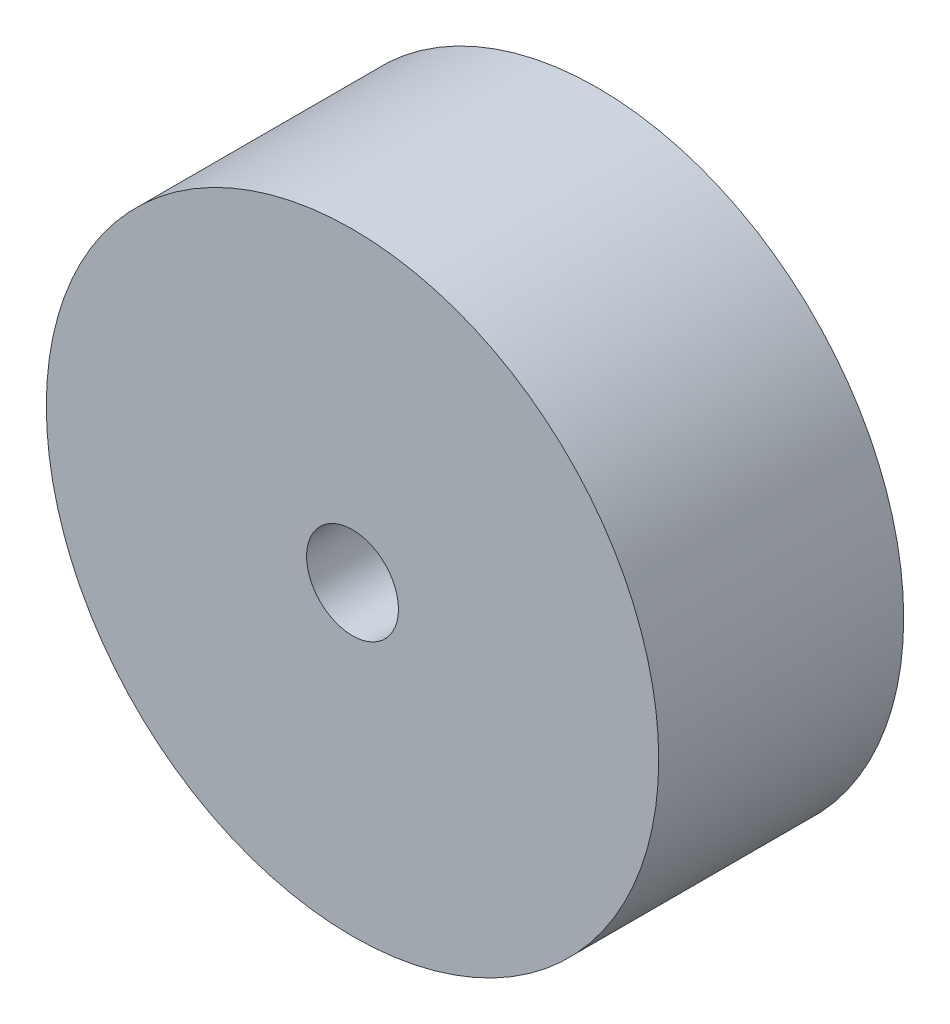
ISO-10303-21;
HEADER;
FILE_DESCRIPTION(('STEP AP214'),'2;1');
FILE_NAME('part.step','',(''),(''),'','','');
FILE_SCHEMA(('AUTOMOTIVE_DESIGN { 1 0 10303 214 1 1 1 1 }'));
ENDSEC;
DATA;
#1=APPLICATION_CONTEXT('core data for automotive mechanical design processes');
#2=APPLICATION_PROTOCOL_DEFINITION('international standard','automotive_design',2000,#1);
#3=PRODUCT_CONTEXT('',#1,'mechanical');
#4=PRODUCT('Part','Part','',(#3));
#5=PRODUCT_RELATED_PRODUCT_CATEGORY('part','',(#4));
#6=PRODUCT_DEFINITION_FORMATION('','',#4);
#7=PRODUCT_DEFINITION_CONTEXT('part definition',#1,'design');
#8=PRODUCT_DEFINITION('design','',#6,#7);
#9=PRODUCT_DEFINITION_SHAPE('','',#8);
#10=(LENGTH_UNIT() NAMED_UNIT(*) SI_UNIT(.MILLI.,.METRE.));
#11=(NAMED_UNIT(*) PLANE_ANGLE_UNIT() SI_UNIT($,.RADIAN.));
#12=(NAMED_UNIT(*) SI_UNIT($,.STERADIAN.) SOLID_ANGLE_UNIT());
#13=UNCERTAINTY_MEASURE_WITH_UNIT(LENGTH_MEASURE(1.E-05),#10,'distance_accuracy_value','');
#14=(GEOMETRIC_REPRESENTATION_CONTEXT(3) GLOBAL_UNCERTAINTY_ASSIGNED_CONTEXT((#13)) GLOBAL_UNIT_ASSIGNED_CONTEXT((#10,
#11,#12)) REPRESENTATION_CONTEXT('',''));
#15=CARTESIAN_POINT('',(0.,0.,0.));
#16=DIRECTION('',(0.,0.,1.));
#17=DIRECTION('',(1.,0.,0.));
#18=AXIS2_PLACEMENT_3D('',#15,#16,#17);
#19=CARTESIAN_POINT('',(0.,0.,8.));
#20=DIRECTION('',(0.,0.,1.));
#21=DIRECTION('',(1.,0.,0.));
#22=AXIS2_PLACEMENT_3D('',#19,#20,#21);
#23=PLANE('',#22);
#24=CARTESIAN_POINT('',(0.,0.,8.));
#25=DIRECTION('',(0.,0.,1.));
#26=DIRECTION('',(1.,0.,0.));
#27=AXIS2_PLACEMENT_3D('',#24,#25,#26);
#28=CIRCLE('',#27,10.);
#29=CARTESIAN_POINT('',(10.,0.,8.));
#30=VERTEX_POINT('',#29);
#31=EDGE_CURVE('E10',#30,#30,#28,.T.);
#32=ORIENTED_EDGE('',*,*,#31,.T.);
#33=EDGE_LOOP('',(#32));
#34=FACE_BOUND('',#33,.T.);
#35=CARTESIAN_POINT('',(0.,0.,8.));
#36=DIRECTION('',(0.,0.,1.));
#37=DIRECTION('',(1.,0.,0.));
#38=AXIS2_PLACEMENT_3D('',#35,#36,#37);
#39=CIRCLE('',#38,1.5);
#40=CARTESIAN_POINT('',(1.5,0.,8.));
#41=VERTEX_POINT('',#40);
#42=EDGE_CURVE('E42',#41,#41,#39,.T.);
#43=ORIENTED_EDGE('',*,*,#42,.F.);
#44=EDGE_LOOP('',(#43));
#45=FACE_BOUND('',#44,.T.);
#46=ADVANCED_FACE('F31',(#34,#45),#23,.T.);
#47=CARTESIAN_POINT('',(0.,0.,0.));
#48=DIRECTION('',(0.,0.,1.));
#49=DIRECTION('',(1.,0.,0.));
#50=AXIS2_PLACEMENT_3D('',#47,#48,#49);
#51=PLANE('',#50);
#52=CARTESIAN_POINT('',(0.,0.,0.));
#53=DIRECTION('',(0.,0.,1.));
#54=DIRECTION('',(1.,0.,0.));
#55=AXIS2_PLACEMENT_3D('',#52,#53,#54);
#56=CIRCLE('',#55,10.);
#57=CARTESIAN_POINT('',(10.,0.,0.));
#58=VERTEX_POINT('',#57);
#59=EDGE_CURVE('E35',#58,#58,#56,.T.);
#60=ORIENTED_EDGE('',*,*,#59,.F.);
#61=EDGE_LOOP('',(#60));
#62=FACE_BOUND('',#61,.T.);
#63=CARTESIAN_POINT('',(0.,0.,0.));
#64=DIRECTION('',(0.,0.,1.));
#65=DIRECTION('',(1.,0.,0.));
#66=AXIS2_PLACEMENT_3D('',#63,#64,#65);
#67=CIRCLE('',#66,1.5);
#68=CARTESIAN_POINT('',(1.5,0.,0.));
#69=VERTEX_POINT('',#68);
#70=EDGE_CURVE('E44',#69,#69,#67,.T.);
#71=ORIENTED_EDGE('',*,*,#70,.T.);
#72=EDGE_LOOP('',(#71));
#73=FACE_BOUND('',#72,.T.);
#74=ADVANCED_FACE('F54',(#62,#73),#51,.F.);
#75=CARTESIAN_POINT('',(0.,0.,8.));
#76=DIRECTION('',(0.,0.,-1.));
#77=DIRECTION('',(-1.,0.,0.));
#78=AXIS2_PLACEMENT_3D('',#75,#76,#77);
#79=CYLINDRICAL_SURFACE('',#78,10.);
#80=ORIENTED_EDGE('',*,*,#31,.F.);
#81=EDGE_LOOP('',(#80));
#82=FACE_BOUND('',#81,.T.);
#83=ORIENTED_EDGE('',*,*,#59,.T.);
#84=EDGE_LOOP('',(#83));
#85=FACE_BOUND('',#84,.T.);
#86=ADVANCED_FACE('F33',(#82,#85),#79,.T.);
#87=CARTESIAN_POINT('',(0.,0.,8.));
#88=DIRECTION('',(0.,0.,-1.));
#89=DIRECTION('',(-1.,0.,0.));
#90=AXIS2_PLACEMENT_3D('',#87,#88,#89);
#91=CYLINDRICAL_SURFACE('',#90,1.5);
#92=ORIENTED_EDGE('',*,*,#42,.T.);
#93=EDGE_LOOP('',(#92));
#94=FACE_BOUND('',#93,.T.);
#95=ORIENTED_EDGE('',*,*,#70,.F.);
#96=EDGE_LOOP('',(#95));
#97=FACE_BOUND('',#96,.T.);
#98=ADVANCED_FACE('F50',(#94,#97),#91,.F.);
#99=CLOSED_SHELL('',(#46,#74,#86,#98));
#100=MANIFOLD_SOLID_BREP('B2',#99);
#101=ADVANCED_BREP_SHAPE_REPRESENTATION('',(#18,#100),#14);
#102=SHAPE_DEFINITION_REPRESENTATION(#9,#101);
ENDSEC;
END-ISO-10303-21;
